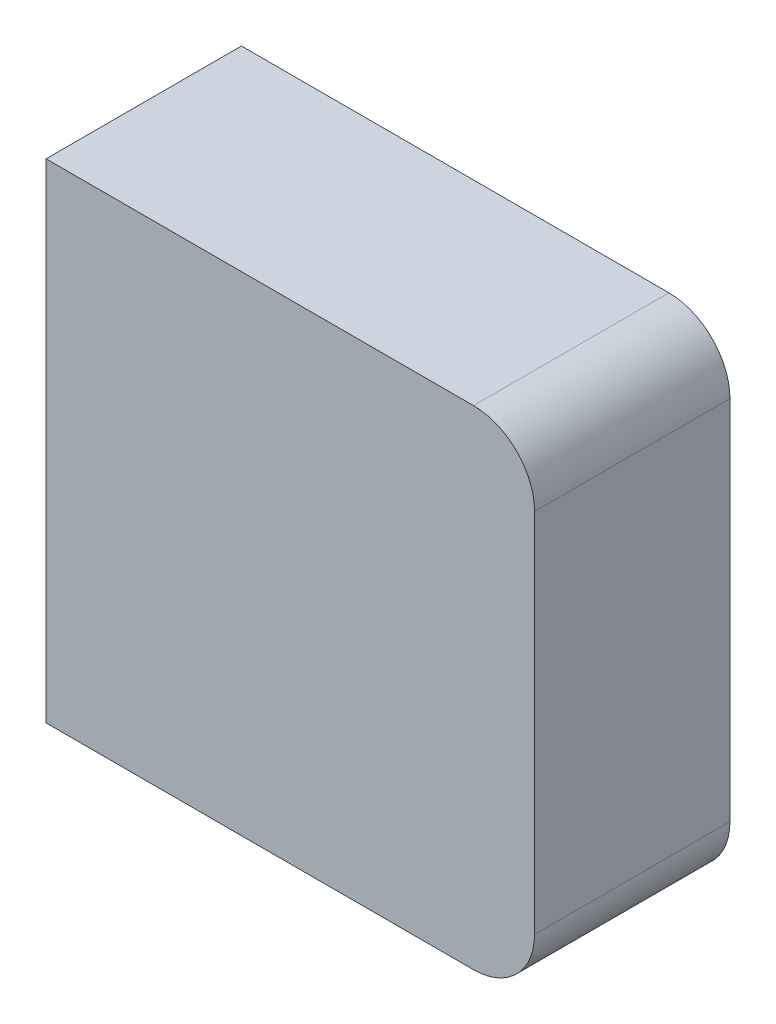
ISO-10303-21;
HEADER;
FILE_DESCRIPTION(('STEP AP214'),'2;1');
FILE_NAME('part.step','',(''),(''),'','','');
FILE_SCHEMA(('AUTOMOTIVE_DESIGN { 1 0 10303 214 1 1 1 1 }'));
ENDSEC;
DATA;
#1=APPLICATION_CONTEXT('core data for automotive mechanical design processes');
#2=APPLICATION_PROTOCOL_DEFINITION('international standard','automotive_design',2000,#1);
#3=PRODUCT_CONTEXT('',#1,'mechanical');
#4=PRODUCT('Part','Part','',(#3));
#5=PRODUCT_RELATED_PRODUCT_CATEGORY('part','',(#4));
#6=PRODUCT_DEFINITION_FORMATION('','',#4);
#7=PRODUCT_DEFINITION_CONTEXT('part definition',#1,'design');
#8=PRODUCT_DEFINITION('design','',#6,#7);
#9=PRODUCT_DEFINITION_SHAPE('','',#8);
#10=(LENGTH_UNIT() NAMED_UNIT(*) SI_UNIT(.MILLI.,.METRE.));
#11=(NAMED_UNIT(*) PLANE_ANGLE_UNIT() SI_UNIT($,.RADIAN.));
#12=(NAMED_UNIT(*) SI_UNIT($,.STERADIAN.) SOLID_ANGLE_UNIT());
#13=UNCERTAINTY_MEASURE_WITH_UNIT(LENGTH_MEASURE(1.E-05),#10,'distance_accuracy_value','');
#14=(GEOMETRIC_REPRESENTATION_CONTEXT(3) GLOBAL_UNCERTAINTY_ASSIGNED_CONTEXT((#13)) GLOBAL_UNIT_ASSIGNED_CONTEXT((#10,
#11,#12)) REPRESENTATION_CONTEXT('',''));
#15=CARTESIAN_POINT('',(0.,0.,0.));
#16=DIRECTION('',(0.,0.,1.));
#17=DIRECTION('',(1.,0.,0.));
#18=AXIS2_PLACEMENT_3D('',#15,#16,#17);
#19=CARTESIAN_POINT('',(-10.,-10.,4.));
#20=DIRECTION('',(1.,0.,0.));
#21=DIRECTION('',(0.,0.,-1.));
#22=AXIS2_PLACEMENT_3D('',#19,#20,#21);
#23=PLANE('',#22);
#24=CARTESIAN_POINT('',(-10.,5.,0.));
#25=DIRECTION('',(-1.,0.,0.));
#26=DIRECTION('',(0.,0.,1.));
#27=AXIS2_PLACEMENT_3D('',#24,#25,#26);
#28=CIRCLE('',#27,2.09999999999999);
#29=CARTESIAN_POINT('',(-10.,5.,2.09999999999999));
#30=VERTEX_POINT('',#29);
#31=EDGE_CURVE('E111',#30,#30,#28,.T.);
#32=ORIENTED_EDGE('',*,*,#31,.F.);
#33=EDGE_LOOP('',(#32));
#34=FACE_BOUND('',#33,.T.);
#35=CARTESIAN_POINT('',(-10.,-5.,0.));
#36=DIRECTION('',(-1.,0.,0.));
#37=DIRECTION('',(0.,0.,1.));
#38=AXIS2_PLACEMENT_3D('',#35,#36,#37);
#39=CIRCLE('',#38,2.09999999999999);
#40=CARTESIAN_POINT('',(-10.,-5.,2.09999999999999));
#41=VERTEX_POINT('',#40);
#42=EDGE_CURVE('E110',#41,#41,#39,.T.);
#43=ORIENTED_EDGE('',*,*,#42,.F.);
#44=EDGE_LOOP('',(#43));
#45=FACE_BOUND('',#44,.T.);
#46=DIRECTION('',(0.,-1.,0.));
#47=VECTOR('',#46,1.);
#48=CARTESIAN_POINT('',(-10.,-10.,-4.));
#49=LINE('',#48,#47);
#50=CARTESIAN_POINT('',(-10.,10.,-4.));
#51=VERTEX_POINT('',#50);
#52=CARTESIAN_POINT('',(-10.,-10.,-4.));
#53=VERTEX_POINT('',#52);
#54=EDGE_CURVE('E125',#51,#53,#49,.T.);
#55=ORIENTED_EDGE('',*,*,#54,.T.);
#56=DIRECTION('',(0.,0.,-1.));
#57=VECTOR('',#56,1.);
#58=CARTESIAN_POINT('',(-10.,-10.,4.));
#59=LINE('',#58,#57);
#60=CARTESIAN_POINT('',(-10.,-10.,4.));
#61=VERTEX_POINT('',#60);
#62=EDGE_CURVE('E156',#61,#53,#59,.T.);
#63=ORIENTED_EDGE('',*,*,#62,.F.);
#64=DIRECTION('',(0.,-1.,0.));
#65=VECTOR('',#64,1.);
#66=CARTESIAN_POINT('',(-10.,-10.,4.));
#67=LINE('',#66,#65);
#68=CARTESIAN_POINT('',(-10.,10.,4.));
#69=VERTEX_POINT('',#68);
#70=EDGE_CURVE('E126',#69,#61,#67,.T.);
#71=ORIENTED_EDGE('',*,*,#70,.F.);
#72=DIRECTION('',(0.,0.,-1.));
#73=VECTOR('',#72,1.);
#74=CARTESIAN_POINT('',(-10.,10.,4.));
#75=LINE('',#74,#73);
#76=EDGE_CURVE('E140',#69,#51,#75,.T.);
#77=ORIENTED_EDGE('',*,*,#76,.T.);
#78=EDGE_LOOP('',(#55,#63,#71,#77));
#79=FACE_BOUND('',#78,.T.);
#80=ADVANCED_FACE('F39',(#34,#45,#79),#23,.F.);
#81=CARTESIAN_POINT('',(10.,-10.,4.));
#82=DIRECTION('',(0.,1.,0.));
#83=DIRECTION('',(-1.,0.,0.));
#84=AXIS2_PLACEMENT_3D('',#81,#82,#83);
#85=PLANE('',#84);
#86=DIRECTION('',(1.,0.,0.));
#87=VECTOR('',#86,1.);
#88=CARTESIAN_POINT('',(10.,-10.,-4.));
#89=LINE('',#88,#87);
#90=CARTESIAN_POINT('',(7.5,-10.,-4.));
#91=VERTEX_POINT('',#90);
#92=EDGE_CURVE('E144',#53,#91,#89,.T.);
#93=ORIENTED_EDGE('',*,*,#92,.T.);
#94=DIRECTION('',(0.,0.,-1.));
#95=VECTOR('',#94,1.);
#96=CARTESIAN_POINT('',(7.5,-10.,4.));
#97=LINE('',#96,#95);
#98=CARTESIAN_POINT('',(7.5,-10.,4.));
#99=VERTEX_POINT('',#98);
#100=EDGE_CURVE('E63',#91,#99,#97,.F.);
#101=ORIENTED_EDGE('',*,*,#100,.T.);
#102=DIRECTION('',(1.,0.,0.));
#103=VECTOR('',#102,1.);
#104=CARTESIAN_POINT('',(10.,-10.,4.));
#105=LINE('',#104,#103);
#106=EDGE_CURVE('E130',#61,#99,#105,.T.);
#107=ORIENTED_EDGE('',*,*,#106,.F.);
#108=ORIENTED_EDGE('',*,*,#62,.T.);
#109=EDGE_LOOP('',(#93,#101,#107,#108));
#110=FACE_BOUND('',#109,.T.);
#111=ADVANCED_FACE('F189',(#110),#85,.F.);
#112=CARTESIAN_POINT('',(10.,-10.,4.));
#113=DIRECTION('',(-1.,0.,0.));
#114=DIRECTION('',(0.,0.,1.));
#115=AXIS2_PLACEMENT_3D('',#112,#113,#114);
#116=PLANE('',#115);
#117=DIRECTION('',(0.,1.,0.));
#118=VECTOR('',#117,1.);
#119=CARTESIAN_POINT('',(10.,-10.,4.));
#120=LINE('',#119,#118);
#121=CARTESIAN_POINT('',(10.,-7.5,4.));
#122=VERTEX_POINT('',#121);
#123=CARTESIAN_POINT('',(10.,7.5,4.));
#124=VERTEX_POINT('',#123);
#125=EDGE_CURVE('E134',#122,#124,#120,.T.);
#126=ORIENTED_EDGE('',*,*,#125,.F.);
#127=DIRECTION('',(0.,0.,-1.));
#128=VECTOR('',#127,1.);
#129=CARTESIAN_POINT('',(10.,-7.5,4.));
#130=LINE('',#129,#128);
#131=CARTESIAN_POINT('',(10.,-7.5,-4.));
#132=VERTEX_POINT('',#131);
#133=EDGE_CURVE('E163',#122,#132,#130,.T.);
#134=ORIENTED_EDGE('',*,*,#133,.T.);
#135=DIRECTION('',(0.,1.,0.));
#136=VECTOR('',#135,1.);
#137=CARTESIAN_POINT('',(10.,-10.,-4.));
#138=LINE('',#137,#136);
#139=CARTESIAN_POINT('',(10.,7.5,-4.));
#140=VERTEX_POINT('',#139);
#141=EDGE_CURVE('E147',#132,#140,#138,.T.);
#142=ORIENTED_EDGE('',*,*,#141,.T.);
#143=DIRECTION('',(0.,0.,-1.));
#144=VECTOR('',#143,1.);
#145=CARTESIAN_POINT('',(10.,7.5,4.));
#146=LINE('',#145,#144);
#147=EDGE_CURVE('E160',#140,#124,#146,.F.);
#148=ORIENTED_EDGE('',*,*,#147,.T.);
#149=EDGE_LOOP('',(#126,#134,#142,#148));
#150=FACE_BOUND('',#149,.T.);
#151=ADVANCED_FACE('F182',(#150),#116,.F.);
#152=CARTESIAN_POINT('',(10.,10.,4.));
#153=DIRECTION('',(0.,-1.,0.));
#154=DIRECTION('',(1.,0.,0.));
#155=AXIS2_PLACEMENT_3D('',#152,#153,#154);
#156=PLANE('',#155);
#157=DIRECTION('',(-1.,0.,0.));
#158=VECTOR('',#157,1.);
#159=CARTESIAN_POINT('',(10.,10.,4.));
#160=LINE('',#159,#158);
#161=CARTESIAN_POINT('',(7.5,10.,4.));
#162=VERTEX_POINT('',#161);
#163=EDGE_CURVE('E137',#162,#69,#160,.T.);
#164=ORIENTED_EDGE('',*,*,#163,.F.);
#165=DIRECTION('',(0.,0.,-1.));
#166=VECTOR('',#165,1.);
#167=CARTESIAN_POINT('',(7.5,10.,4.));
#168=LINE('',#167,#166);
#169=CARTESIAN_POINT('',(7.5,10.,-4.));
#170=VERTEX_POINT('',#169);
#171=EDGE_CURVE('E11',#162,#170,#168,.T.);
#172=ORIENTED_EDGE('',*,*,#171,.T.);
#173=DIRECTION('',(-1.,0.,0.));
#174=VECTOR('',#173,1.);
#175=CARTESIAN_POINT('',(10.,10.,-4.));
#176=LINE('',#175,#174);
#177=EDGE_CURVE('E131',#170,#51,#176,.T.);
#178=ORIENTED_EDGE('',*,*,#177,.T.);
#179=ORIENTED_EDGE('',*,*,#76,.F.);
#180=EDGE_LOOP('',(#164,#172,#178,#179));
#181=FACE_BOUND('',#180,.T.);
#182=ADVANCED_FACE('F196',(#181),#156,.F.);
#183=CARTESIAN_POINT('',(0.,0.,4.));
#184=DIRECTION('',(0.,0.,1.));
#185=DIRECTION('',(1.,0.,0.));
#186=AXIS2_PLACEMENT_3D('',#183,#184,#185);
#187=PLANE('',#186);
#188=ORIENTED_EDGE('',*,*,#106,.T.);
#189=CARTESIAN_POINT('',(7.5,-7.5,4.));
#190=DIRECTION('',(0.,0.,1.));
#191=DIRECTION('',(1.,0.,0.));
#192=AXIS2_PLACEMENT_3D('',#189,#190,#191);
#193=CIRCLE('',#192,2.5);
#194=EDGE_CURVE('E48',#99,#122,#193,.T.);
#195=ORIENTED_EDGE('',*,*,#194,.T.);
#196=ORIENTED_EDGE('',*,*,#125,.T.);
#197=CARTESIAN_POINT('',(7.5,7.5,4.));
#198=DIRECTION('',(0.,0.,1.));
#199=DIRECTION('',(1.,0.,0.));
#200=AXIS2_PLACEMENT_3D('',#197,#198,#199);
#201=CIRCLE('',#200,2.5);
#202=EDGE_CURVE('E55',#124,#162,#201,.T.);
#203=ORIENTED_EDGE('',*,*,#202,.T.);
#204=ORIENTED_EDGE('',*,*,#163,.T.);
#205=ORIENTED_EDGE('',*,*,#70,.T.);
#206=EDGE_LOOP('',(#188,#195,#196,#203,#204,#205));
#207=FACE_BOUND('',#206,.T.);
#208=ADVANCED_FACE('F178',(#207),#187,.T.);
#209=CARTESIAN_POINT('',(0.,0.,-4.));
#210=DIRECTION('',(0.,0.,1.));
#211=DIRECTION('',(1.,0.,0.));
#212=AXIS2_PLACEMENT_3D('',#209,#210,#211);
#213=PLANE('',#212);
#214=ORIENTED_EDGE('',*,*,#141,.F.);
#215=CARTESIAN_POINT('',(7.5,-7.5,-4.));
#216=DIRECTION('',(0.,0.,1.));
#217=DIRECTION('',(1.,0.,0.));
#218=AXIS2_PLACEMENT_3D('',#215,#216,#217);
#219=CIRCLE('',#218,2.5);
#220=EDGE_CURVE('E170',#132,#91,#219,.F.);
#221=ORIENTED_EDGE('',*,*,#220,.T.);
#222=ORIENTED_EDGE('',*,*,#92,.F.);
#223=ORIENTED_EDGE('',*,*,#54,.F.);
#224=ORIENTED_EDGE('',*,*,#177,.F.);
#225=CARTESIAN_POINT('',(7.5,7.5,-4.));
#226=DIRECTION('',(0.,0.,1.));
#227=DIRECTION('',(1.,0.,0.));
#228=AXIS2_PLACEMENT_3D('',#225,#226,#227);
#229=CIRCLE('',#228,2.5);
#230=EDGE_CURVE('E167',#170,#140,#229,.F.);
#231=ORIENTED_EDGE('',*,*,#230,.T.);
#232=EDGE_LOOP('',(#214,#221,#222,#223,#224,#231));
#233=FACE_BOUND('',#232,.T.);
#234=ADVANCED_FACE('F187',(#233),#213,.F.);
#235=CARTESIAN_POINT('',(7.5,-7.5,4.));
#236=DIRECTION('',(0.,0.,-1.));
#237=DIRECTION('',(-1.,0.,0.));
#238=AXIS2_PLACEMENT_3D('',#235,#236,#237);
#239=CYLINDRICAL_SURFACE('',#238,2.5);
#240=ORIENTED_EDGE('',*,*,#194,.F.);
#241=ORIENTED_EDGE('',*,*,#100,.F.);
#242=ORIENTED_EDGE('',*,*,#220,.F.);
#243=ORIENTED_EDGE('',*,*,#133,.F.);
#244=EDGE_LOOP('',(#240,#241,#242,#243));
#245=FACE_BOUND('',#244,.T.);
#246=ADVANCED_FACE('F185',(#245),#239,.T.);
#247=CARTESIAN_POINT('',(7.5,7.5,4.));
#248=DIRECTION('',(0.,0.,-1.));
#249=DIRECTION('',(-1.,0.,0.));
#250=AXIS2_PLACEMENT_3D('',#247,#248,#249);
#251=CYLINDRICAL_SURFACE('',#250,2.5);
#252=ORIENTED_EDGE('',*,*,#202,.F.);
#253=ORIENTED_EDGE('',*,*,#147,.F.);
#254=ORIENTED_EDGE('',*,*,#230,.F.);
#255=ORIENTED_EDGE('',*,*,#171,.F.);
#256=EDGE_LOOP('',(#252,#253,#254,#255));
#257=FACE_BOUND('',#256,.T.);
#258=ADVANCED_FACE('F41',(#257),#251,.T.);
#259=CARTESIAN_POINT('',(-3.2,-5.,0.));
#260=DIRECTION('',(-1.,0.,0.));
#261=DIRECTION('',(0.,0.,1.));
#262=AXIS2_PLACEMENT_3D('',#259,#260,#261);
#263=CONICAL_SURFACE('',#262,2.09999999999999,1.02974425867665);
#264=CARTESIAN_POINT('',(-1.93819270004213,-5.,0.));
#265=VERTEX_POINT('',#264);
#266=VERTEX_LOOP('',#265);
#267=FACE_BOUND('',#266,.T.);
#268=CARTESIAN_POINT('',(-3.2,-5.,0.));
#269=DIRECTION('',(-1.,0.,0.));
#270=DIRECTION('',(0.,0.,1.));
#271=AXIS2_PLACEMENT_3D('',#268,#269,#270);
#272=CIRCLE('',#271,2.09999999999999);
#273=CARTESIAN_POINT('',(-3.2,-5.,2.09999999999999));
#274=VERTEX_POINT('',#273);
#275=EDGE_CURVE('E116',#274,#274,#272,.T.);
#276=ORIENTED_EDGE('',*,*,#275,.T.);
#277=EDGE_LOOP('',(#276));
#278=FACE_BOUND('',#277,.T.);
#279=ADVANCED_FACE('F200',(#267,#278),#263,.F.);
#280=CARTESIAN_POINT('',(-10.,-5.,0.));
#281=DIRECTION('',(-1.,0.,0.));
#282=DIRECTION('',(0.,0.,1.));
#283=AXIS2_PLACEMENT_3D('',#280,#281,#282);
#284=CYLINDRICAL_SURFACE('',#283,2.09999999999999);
#285=ORIENTED_EDGE('',*,*,#275,.F.);
#286=EDGE_LOOP('',(#285));
#287=FACE_BOUND('',#286,.T.);
#288=ORIENTED_EDGE('',*,*,#42,.T.);
#289=EDGE_LOOP('',(#288));
#290=FACE_BOUND('',#289,.T.);
#291=ADVANCED_FACE('F103',(#287,#290),#284,.F.);
#292=CARTESIAN_POINT('',(-3.2,5.,0.));
#293=DIRECTION('',(-1.,0.,0.));
#294=DIRECTION('',(0.,0.,1.));
#295=AXIS2_PLACEMENT_3D('',#292,#293,#294);
#296=CONICAL_SURFACE('',#295,2.09999999999999,1.02974425867665);
#297=CARTESIAN_POINT('',(-1.93819270004213,5.,0.));
#298=VERTEX_POINT('',#297);
#299=VERTEX_LOOP('',#298);
#300=FACE_BOUND('',#299,.T.);
#301=CARTESIAN_POINT('',(-3.2,5.,0.));
#302=DIRECTION('',(-1.,0.,0.));
#303=DIRECTION('',(0.,0.,1.));
#304=AXIS2_PLACEMENT_3D('',#301,#302,#303);
#305=CIRCLE('',#304,2.09999999999999);
#306=CARTESIAN_POINT('',(-3.2,5.,2.09999999999999));
#307=VERTEX_POINT('',#306);
#308=EDGE_CURVE('E107',#307,#307,#305,.T.);
#309=ORIENTED_EDGE('',*,*,#308,.T.);
#310=EDGE_LOOP('',(#309));
#311=FACE_BOUND('',#310,.T.);
#312=ADVANCED_FACE('F99',(#300,#311),#296,.F.);
#313=CARTESIAN_POINT('',(-10.,5.,0.));
#314=DIRECTION('',(-1.,0.,0.));
#315=DIRECTION('',(0.,0.,1.));
#316=AXIS2_PLACEMENT_3D('',#313,#314,#315);
#317=CYLINDRICAL_SURFACE('',#316,2.09999999999999);
#318=ORIENTED_EDGE('',*,*,#308,.F.);
#319=EDGE_LOOP('',(#318));
#320=FACE_BOUND('',#319,.T.);
#321=ORIENTED_EDGE('',*,*,#31,.T.);
#322=EDGE_LOOP('',(#321));
#323=FACE_BOUND('',#322,.T.);
#324=ADVANCED_FACE('F102',(#320,#323),#317,.F.);
#325=CLOSED_SHELL('',(#80,#111,#151,#182,#208,#234,#246,#258,#279,#291,#312,#324));
#326=MANIFOLD_SOLID_BREP('B2',#325);
#327=ADVANCED_BREP_SHAPE_REPRESENTATION('',(#18,#326),#14);
#328=SHAPE_DEFINITION_REPRESENTATION(#9,#327);
ENDSEC;
END-ISO-10303-21;
